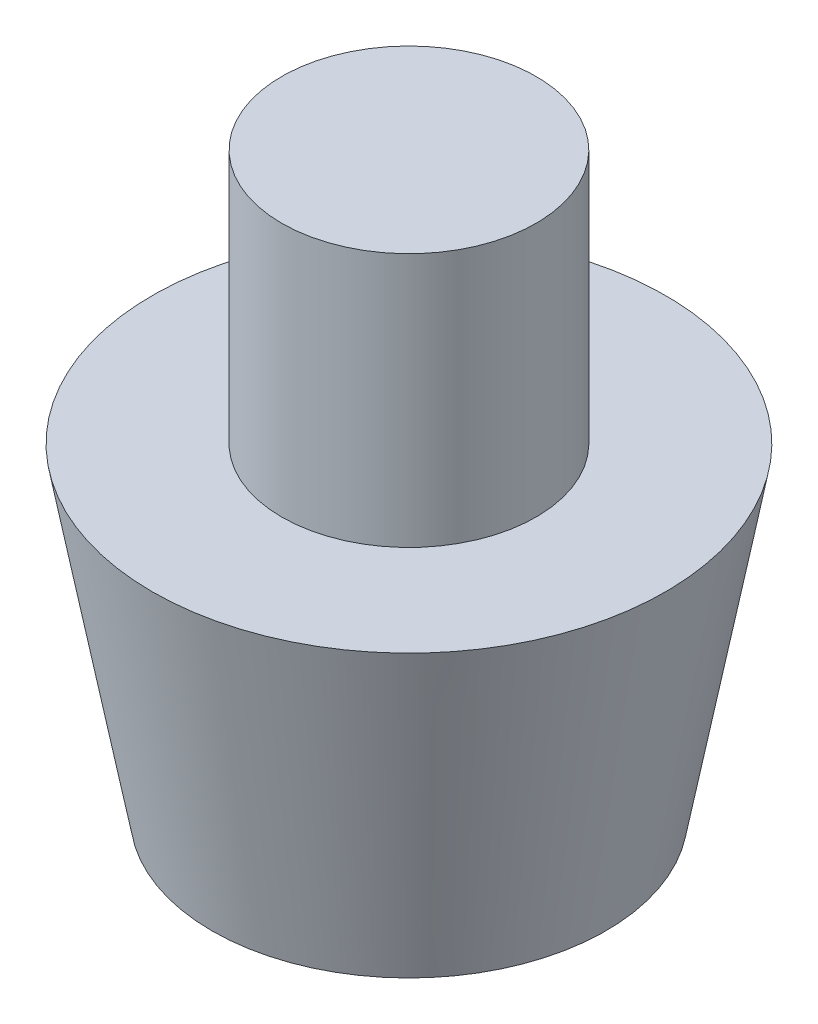
ISO-10303-21;
HEADER;
FILE_DESCRIPTION(('STEP AP214'),'2;1');
FILE_NAME('part.step','',(''),(''),'','','');
FILE_SCHEMA(('AUTOMOTIVE_DESIGN { 1 0 10303 214 1 1 1 1 }'));
ENDSEC;
DATA;
#1=APPLICATION_CONTEXT('core data for automotive mechanical design processes');
#2=APPLICATION_PROTOCOL_DEFINITION('international standard','automotive_design',2000,#1);
#3=PRODUCT_CONTEXT('',#1,'mechanical');
#4=PRODUCT('Part','Part','',(#3));
#5=PRODUCT_RELATED_PRODUCT_CATEGORY('part','',(#4));
#6=PRODUCT_DEFINITION_FORMATION('','',#4);
#7=PRODUCT_DEFINITION_CONTEXT('part definition',#1,'design');
#8=PRODUCT_DEFINITION('design','',#6,#7);
#9=PRODUCT_DEFINITION_SHAPE('','',#8);
#10=(LENGTH_UNIT() NAMED_UNIT(*) SI_UNIT(.MILLI.,.METRE.));
#11=(NAMED_UNIT(*) PLANE_ANGLE_UNIT() SI_UNIT($,.RADIAN.));
#12=(NAMED_UNIT(*) SI_UNIT($,.STERADIAN.) SOLID_ANGLE_UNIT());
#13=UNCERTAINTY_MEASURE_WITH_UNIT(LENGTH_MEASURE(1.E-05),#10,'distance_accuracy_value','');
#14=(GEOMETRIC_REPRESENTATION_CONTEXT(3) GLOBAL_UNCERTAINTY_ASSIGNED_CONTEXT((#13)) GLOBAL_UNIT_ASSIGNED_CONTEXT((#10,
#11,#12)) REPRESENTATION_CONTEXT('',''));
#15=CARTESIAN_POINT('',(0.,0.,0.));
#16=DIRECTION('',(0.,0.,1.));
#17=DIRECTION('',(1.,0.,0.));
#18=AXIS2_PLACEMENT_3D('',#15,#16,#17);
#19=CARTESIAN_POINT('',(-27.5938978093184,114.596985440859,0.));
#20=DIRECTION('',(0.,1.,0.));
#21=DIRECTION('',(0.,0.,1.));
#22=AXIS2_PLACEMENT_3D('',#19,#20,#21);
#23=PLANE('',#22);
#24=CARTESIAN_POINT('',(-27.5938978093184,114.596985440859,0.));
#25=DIRECTION('',(0.,1.,0.));
#26=DIRECTION('',(0.,0.,1.));
#27=AXIS2_PLACEMENT_3D('',#24,#25,#26);
#28=CIRCLE('',#27,25.);
#29=CARTESIAN_POINT('',(-27.5938978093184,114.596985440859,25.));
#30=VERTEX_POINT('',#29);
#31=EDGE_CURVE('E10',#30,#30,#28,.T.);
#32=ORIENTED_EDGE('',*,*,#31,.F.);
#33=EDGE_LOOP('',(#32));
#34=FACE_BOUND('',#33,.T.);
#35=CARTESIAN_POINT('',(-27.5938978093184,114.596985440859,0.));
#36=DIRECTION('',(0.,1.,0.));
#37=DIRECTION('',(0.,0.,1.));
#38=AXIS2_PLACEMENT_3D('',#35,#36,#37);
#39=CIRCLE('',#38,50.4323576047457);
#40=CARTESIAN_POINT('',(-27.5938978093184,114.596985440859,50.4323576047457));
#41=VERTEX_POINT('',#40);
#42=EDGE_CURVE('E42',#41,#41,#39,.T.);
#43=ORIENTED_EDGE('',*,*,#42,.T.);
#44=EDGE_LOOP('',(#43));
#45=FACE_BOUND('',#44,.T.);
#46=ADVANCED_FACE('F31',(#34,#45),#23,.T.);
#47=CARTESIAN_POINT('',(-66.3060596326795,51.0238022630455,0.));
#48=DIRECTION('',(0.,-1.,0.));
#49=DIRECTION('',(0.,0.,-1.));
#50=AXIS2_PLACEMENT_3D('',#47,#48,#49);
#51=PLANE('',#50);
#52=CARTESIAN_POINT('',(-27.5938978093184,51.0238022630455,0.));
#53=DIRECTION('',(0.,1.,0.));
#54=DIRECTION('',(0.,0.,1.));
#55=AXIS2_PLACEMENT_3D('',#52,#53,#54);
#56=CIRCLE('',#55,38.7121618233611);
#57=CARTESIAN_POINT('',(-27.5938978093184,51.0238022630455,38.7121618233611));
#58=VERTEX_POINT('',#57);
#59=EDGE_CURVE('E34',#58,#58,#56,.T.);
#60=ORIENTED_EDGE('',*,*,#59,.F.);
#61=EDGE_LOOP('',(#60));
#62=FACE_BOUND('',#61,.T.);
#63=ADVANCED_FACE('F62',(#62),#51,.T.);
#64=CARTESIAN_POINT('',(-27.5938978093184,114.596985440859,0.));
#65=DIRECTION('',(0.,1.,0.));
#66=DIRECTION('',(0.,0.,1.));
#67=AXIS2_PLACEMENT_3D('',#64,#65,#66);
#68=CONICAL_SURFACE('',#67,50.4323576047457,0.182310497305305);
#69=ORIENTED_EDGE('',*,*,#59,.T.);
#70=EDGE_LOOP('',(#69));
#71=FACE_BOUND('',#70,.T.);
#72=ORIENTED_EDGE('',*,*,#42,.F.);
#73=EDGE_LOOP('',(#72));
#74=FACE_BOUND('',#73,.T.);
#75=ADVANCED_FACE('F55',(#71,#74),#68,.T.);
#76=CARTESIAN_POINT('',(-27.5938978093184,164.596985440859,0.));
#77=DIRECTION('',(0.,-1.,0.));
#78=DIRECTION('',(0.,0.,-1.));
#79=AXIS2_PLACEMENT_3D('',#76,#77,#78);
#80=CYLINDRICAL_SURFACE('',#79,25.);
#81=CARTESIAN_POINT('',(-27.5938978093184,164.596985440859,0.));
#82=DIRECTION('',(0.,1.,0.));
#83=DIRECTION('',(0.,0.,1.));
#84=AXIS2_PLACEMENT_3D('',#81,#82,#83);
#85=CIRCLE('',#84,25.);
#86=CARTESIAN_POINT('',(-27.5938978093184,164.596985440859,25.));
#87=VERTEX_POINT('',#86);
#88=EDGE_CURVE('E44',#87,#87,#85,.T.);
#89=ORIENTED_EDGE('',*,*,#88,.F.);
#90=EDGE_LOOP('',(#89));
#91=FACE_BOUND('',#90,.T.);
#92=ORIENTED_EDGE('',*,*,#31,.T.);
#93=EDGE_LOOP('',(#92));
#94=FACE_BOUND('',#93,.T.);
#95=ADVANCED_FACE('F53',(#91,#94),#80,.T.);
#96=CARTESIAN_POINT('',(-27.5938978093184,164.596985440859,0.));
#97=DIRECTION('',(0.,1.,0.));
#98=DIRECTION('',(0.,0.,1.));
#99=AXIS2_PLACEMENT_3D('',#96,#97,#98);
#100=PLANE('',#99);
#101=ORIENTED_EDGE('',*,*,#88,.T.);
#102=EDGE_LOOP('',(#101));
#103=FACE_BOUND('',#102,.T.);
#104=ADVANCED_FACE('F51',(#103),#100,.T.);
#105=CLOSED_SHELL('',(#46,#63,#75,#95,#104));
#106=MANIFOLD_SOLID_BREP('B2',#105);
#107=ADVANCED_BREP_SHAPE_REPRESENTATION('',(#18,#106),#14);
#108=SHAPE_DEFINITION_REPRESENTATION(#9,#107);
ENDSEC;
END-ISO-10303-21;
